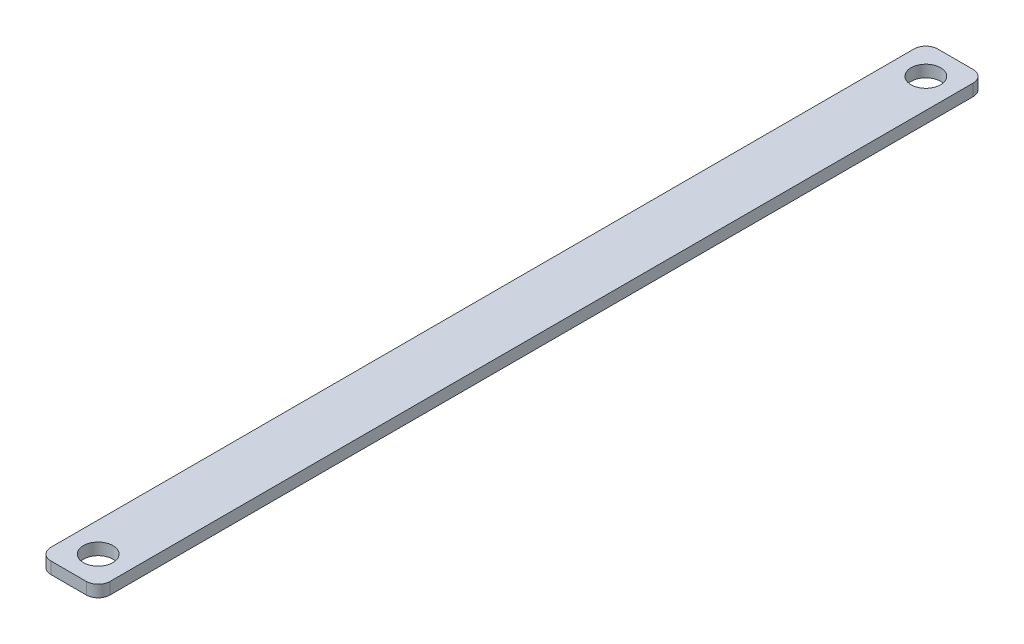
ISO-10303-21;
HEADER;
FILE_DESCRIPTION(('STEP AP214'),'2;1');
FILE_NAME('part.step','',(''),(''),'','','');
FILE_SCHEMA(('AUTOMOTIVE_DESIGN { 1 0 10303 214 1 1 1 1 }'));
ENDSEC;
DATA;
#1=APPLICATION_CONTEXT('core data for automotive mechanical design processes');
#2=APPLICATION_PROTOCOL_DEFINITION('international standard','automotive_design',2000,#1);
#3=PRODUCT_CONTEXT('',#1,'mechanical');
#4=PRODUCT('Part','Part','',(#3));
#5=PRODUCT_RELATED_PRODUCT_CATEGORY('part','',(#4));
#6=PRODUCT_DEFINITION_FORMATION('','',#4);
#7=PRODUCT_DEFINITION_CONTEXT('part definition',#1,'design');
#8=PRODUCT_DEFINITION('design','',#6,#7);
#9=PRODUCT_DEFINITION_SHAPE('','',#8);
#10=(LENGTH_UNIT() NAMED_UNIT(*) SI_UNIT(.MILLI.,.METRE.));
#11=(NAMED_UNIT(*) PLANE_ANGLE_UNIT() SI_UNIT($,.RADIAN.));
#12=(NAMED_UNIT(*) SI_UNIT($,.STERADIAN.) SOLID_ANGLE_UNIT());
#13=UNCERTAINTY_MEASURE_WITH_UNIT(LENGTH_MEASURE(1.E-05),#10,'distance_accuracy_value','');
#14=(GEOMETRIC_REPRESENTATION_CONTEXT(3) GLOBAL_UNCERTAINTY_ASSIGNED_CONTEXT((#13)) GLOBAL_UNIT_ASSIGNED_CONTEXT((#10,
#11,#12)) REPRESENTATION_CONTEXT('',''));
#15=CARTESIAN_POINT('',(0.,0.,0.));
#16=DIRECTION('',(0.,0.,1.));
#17=DIRECTION('',(1.,0.,0.));
#18=AXIS2_PLACEMENT_3D('',#15,#16,#17);
#19=CARTESIAN_POINT('',(40.,10.,-10.));
#20=DIRECTION('',(0.,1.,0.));
#21=DIRECTION('',(0.,0.,1.));
#22=AXIS2_PLACEMENT_3D('',#19,#20,#21);
#23=PLANE('',#22);
#24=CARTESIAN_POINT('',(25.,10.,-25.));
#25=DIRECTION('',(0.,1.,0.));
#26=DIRECTION('',(0.,0.,1.));
#27=AXIS2_PLACEMENT_3D('',#24,#25,#26);
#28=CIRCLE('',#27,12.5);
#29=CARTESIAN_POINT('',(25.,10.,-12.5));
#30=VERTEX_POINT('',#29);
#31=EDGE_CURVE('E134',#30,#30,#28,.T.);
#32=ORIENTED_EDGE('',*,*,#31,.F.);
#33=EDGE_LOOP('',(#32));
#34=FACE_BOUND('',#33,.T.);
#35=CARTESIAN_POINT('',(40.,10.,-10.));
#36=DIRECTION('',(0.,1.,0.));
#37=DIRECTION('',(0.,0.,1.));
#38=AXIS2_PLACEMENT_3D('',#35,#36,#37);
#39=CIRCLE('',#38,10.);
#40=CARTESIAN_POINT('',(39.9999999999999,10.,0.));
#41=VERTEX_POINT('',#40);
#42=CARTESIAN_POINT('',(50.,10.,-10.0000000000001));
#43=VERTEX_POINT('',#42);
#44=EDGE_CURVE('E145',#41,#43,#39,.T.);
#45=ORIENTED_EDGE('',*,*,#44,.T.);
#46=DIRECTION('',(0.,0.,-1.));
#47=VECTOR('',#46,1.);
#48=CARTESIAN_POINT('',(50.,10.,-10.0000000000001));
#49=LINE('',#48,#47);
#50=CARTESIAN_POINT('',(49.9999999999999,10.,-740.));
#51=VERTEX_POINT('',#50);
#52=EDGE_CURVE('E93',#43,#51,#49,.T.);
#53=ORIENTED_EDGE('',*,*,#52,.T.);
#54=CARTESIAN_POINT('',(39.9999999999999,10.,-740.));
#55=DIRECTION('',(0.,1.,0.));
#56=DIRECTION('',(0.,0.,-1.));
#57=AXIS2_PLACEMENT_3D('',#54,#55,#56);
#58=CIRCLE('',#57,10.);
#59=CARTESIAN_POINT('',(39.9999999999999,10.,-750.));
#60=VERTEX_POINT('',#59);
#61=EDGE_CURVE('E160',#51,#60,#58,.T.);
#62=ORIENTED_EDGE('',*,*,#61,.T.);
#63=DIRECTION('',(-1.,0.,0.));
#64=VECTOR('',#63,1.);
#65=CARTESIAN_POINT('',(10.,10.,-750.));
#66=LINE('',#65,#64);
#67=CARTESIAN_POINT('',(10.,10.,-750.));
#68=VERTEX_POINT('',#67);
#69=EDGE_CURVE('E173',#60,#68,#66,.T.);
#70=ORIENTED_EDGE('',*,*,#69,.T.);
#71=CARTESIAN_POINT('',(10.,10.,-740.));
#72=DIRECTION('',(0.,1.,0.));
#73=DIRECTION('',(0.,0.,-1.));
#74=AXIS2_PLACEMENT_3D('',#71,#72,#73);
#75=CIRCLE('',#74,10.);
#76=CARTESIAN_POINT('',(0.,10.,-740.));
#77=VERTEX_POINT('',#76);
#78=EDGE_CURVE('E112',#68,#77,#75,.T.);
#79=ORIENTED_EDGE('',*,*,#78,.T.);
#80=DIRECTION('',(0.,0.,1.));
#81=VECTOR('',#80,1.);
#82=CARTESIAN_POINT('',(0.,10.,-10.0000000000001));
#83=LINE('',#82,#81);
#84=CARTESIAN_POINT('',(0.,10.,-10.0000000000001));
#85=VERTEX_POINT('',#84);
#86=EDGE_CURVE('E106',#77,#85,#83,.T.);
#87=ORIENTED_EDGE('',*,*,#86,.T.);
#88=CARTESIAN_POINT('',(10.,10.,-10.));
#89=DIRECTION('',(0.,1.,0.));
#90=DIRECTION('',(0.,0.,-1.));
#91=AXIS2_PLACEMENT_3D('',#88,#89,#90);
#92=CIRCLE('',#91,10.);
#93=CARTESIAN_POINT('',(10.0000000000001,10.,0.));
#94=VERTEX_POINT('',#93);
#95=EDGE_CURVE('E110',#85,#94,#92,.T.);
#96=ORIENTED_EDGE('',*,*,#95,.T.);
#97=DIRECTION('',(1.,0.,0.));
#98=VECTOR('',#97,1.);
#99=CARTESIAN_POINT('',(10.0000000000001,10.,0.));
#100=LINE('',#99,#98);
#101=EDGE_CURVE('E50',#94,#41,#100,.T.);
#102=ORIENTED_EDGE('',*,*,#101,.T.);
#103=EDGE_LOOP('',(#45,#53,#62,#70,#79,#87,#96,#102));
#104=FACE_BOUND('',#103,.T.);
#105=CARTESIAN_POINT('',(25.,10.,-725.));
#106=DIRECTION('',(0.,1.,0.));
#107=DIRECTION('',(0.,0.,1.));
#108=AXIS2_PLACEMENT_3D('',#105,#106,#107);
#109=CIRCLE('',#108,12.5);
#110=CARTESIAN_POINT('',(25.,10.,-712.5));
#111=VERTEX_POINT('',#110);
#112=EDGE_CURVE('E182',#111,#111,#109,.T.);
#113=ORIENTED_EDGE('',*,*,#112,.F.);
#114=EDGE_LOOP('',(#113));
#115=FACE_BOUND('',#114,.T.);
#116=ADVANCED_FACE('F33',(#34,#104,#115),#23,.T.);
#117=CARTESIAN_POINT('',(40.,0.,-10.));
#118=DIRECTION('',(0.,1.,0.));
#119=DIRECTION('',(0.,0.,1.));
#120=AXIS2_PLACEMENT_3D('',#117,#118,#119);
#121=PLANE('',#120);
#122=CARTESIAN_POINT('',(25.,0.,-25.));
#123=DIRECTION('',(0.,1.,0.));
#124=DIRECTION('',(0.,0.,1.));
#125=AXIS2_PLACEMENT_3D('',#122,#123,#124);
#126=CIRCLE('',#125,12.5);
#127=CARTESIAN_POINT('',(25.,0.,-12.5));
#128=VERTEX_POINT('',#127);
#129=EDGE_CURVE('E179',#128,#128,#126,.T.);
#130=ORIENTED_EDGE('',*,*,#129,.T.);
#131=EDGE_LOOP('',(#130));
#132=FACE_BOUND('',#131,.T.);
#133=CARTESIAN_POINT('',(40.,0.,-10.));
#134=DIRECTION('',(0.,1.,0.));
#135=DIRECTION('',(0.,0.,1.));
#136=AXIS2_PLACEMENT_3D('',#133,#134,#135);
#137=CIRCLE('',#136,10.);
#138=CARTESIAN_POINT('',(39.9999999999999,0.,0.));
#139=VERTEX_POINT('',#138);
#140=CARTESIAN_POINT('',(50.,0.,-10.0000000000001));
#141=VERTEX_POINT('',#140);
#142=EDGE_CURVE('E130',#139,#141,#137,.T.);
#143=ORIENTED_EDGE('',*,*,#142,.F.);
#144=DIRECTION('',(1.,0.,0.));
#145=VECTOR('',#144,1.);
#146=CARTESIAN_POINT('',(10.0000000000001,0.,0.));
#147=LINE('',#146,#145);
#148=CARTESIAN_POINT('',(10.0000000000001,0.,0.));
#149=VERTEX_POINT('',#148);
#150=EDGE_CURVE('E85',#149,#139,#147,.T.);
#151=ORIENTED_EDGE('',*,*,#150,.F.);
#152=CARTESIAN_POINT('',(10.,0.,-10.));
#153=DIRECTION('',(0.,1.,0.));
#154=DIRECTION('',(0.,0.,-1.));
#155=AXIS2_PLACEMENT_3D('',#152,#153,#154);
#156=CIRCLE('',#155,10.);
#157=CARTESIAN_POINT('',(0.,0.,-10.0000000000001));
#158=VERTEX_POINT('',#157);
#159=EDGE_CURVE('E79',#158,#149,#156,.T.);
#160=ORIENTED_EDGE('',*,*,#159,.F.);
#161=DIRECTION('',(0.,0.,1.));
#162=VECTOR('',#161,1.);
#163=CARTESIAN_POINT('',(0.,0.,-10.0000000000001));
#164=LINE('',#163,#162);
#165=CARTESIAN_POINT('',(0.,0.,-740.));
#166=VERTEX_POINT('',#165);
#167=EDGE_CURVE('E120',#166,#158,#164,.T.);
#168=ORIENTED_EDGE('',*,*,#167,.F.);
#169=CARTESIAN_POINT('',(10.,0.,-740.));
#170=DIRECTION('',(0.,1.,0.));
#171=DIRECTION('',(0.,0.,-1.));
#172=AXIS2_PLACEMENT_3D('',#169,#170,#171);
#173=CIRCLE('',#172,10.);
#174=CARTESIAN_POINT('',(10.,0.,-750.));
#175=VERTEX_POINT('',#174);
#176=EDGE_CURVE('E140',#175,#166,#173,.T.);
#177=ORIENTED_EDGE('',*,*,#176,.F.);
#178=DIRECTION('',(-1.,0.,0.));
#179=VECTOR('',#178,1.);
#180=CARTESIAN_POINT('',(10.,0.,-750.));
#181=LINE('',#180,#179);
#182=CARTESIAN_POINT('',(39.9999999999999,0.,-750.));
#183=VERTEX_POINT('',#182);
#184=EDGE_CURVE('E138',#183,#175,#181,.T.);
#185=ORIENTED_EDGE('',*,*,#184,.F.);
#186=CARTESIAN_POINT('',(39.9999999999999,0.,-740.));
#187=DIRECTION('',(0.,1.,0.));
#188=DIRECTION('',(0.,0.,-1.));
#189=AXIS2_PLACEMENT_3D('',#186,#187,#188);
#190=CIRCLE('',#189,10.);
#191=CARTESIAN_POINT('',(49.9999999999999,0.,-740.));
#192=VERTEX_POINT('',#191);
#193=EDGE_CURVE('E136',#192,#183,#190,.T.);
#194=ORIENTED_EDGE('',*,*,#193,.F.);
#195=DIRECTION('',(0.,0.,-1.));
#196=VECTOR('',#195,1.);
#197=CARTESIAN_POINT('',(50.,0.,-10.0000000000001));
#198=LINE('',#197,#196);
#199=EDGE_CURVE('E133',#141,#192,#198,.T.);
#200=ORIENTED_EDGE('',*,*,#199,.F.);
#201=EDGE_LOOP('',(#143,#151,#160,#168,#177,#185,#194,#200));
#202=FACE_BOUND('',#201,.T.);
#203=CARTESIAN_POINT('',(25.,0.,-725.));
#204=DIRECTION('',(0.,1.,0.));
#205=DIRECTION('',(0.,0.,1.));
#206=AXIS2_PLACEMENT_3D('',#203,#204,#205);
#207=CIRCLE('',#206,12.5);
#208=CARTESIAN_POINT('',(25.,0.,-712.5));
#209=VERTEX_POINT('',#208);
#210=EDGE_CURVE('E185',#209,#209,#207,.T.);
#211=ORIENTED_EDGE('',*,*,#210,.T.);
#212=EDGE_LOOP('',(#211));
#213=FACE_BOUND('',#212,.T.);
#214=ADVANCED_FACE('F164',(#132,#202,#213),#121,.F.);
#215=CARTESIAN_POINT('',(40.,10.,-10.));
#216=DIRECTION('',(0.,-1.,0.));
#217=DIRECTION('',(0.,0.,-1.));
#218=AXIS2_PLACEMENT_3D('',#215,#216,#217);
#219=CYLINDRICAL_SURFACE('',#218,10.);
#220=ORIENTED_EDGE('',*,*,#142,.T.);
#221=DIRECTION('',(0.,-1.,0.));
#222=VECTOR('',#221,1.);
#223=CARTESIAN_POINT('',(50.,10.,-10.0000000000001));
#224=LINE('',#223,#222);
#225=EDGE_CURVE('E11',#43,#141,#224,.T.);
#226=ORIENTED_EDGE('',*,*,#225,.F.);
#227=ORIENTED_EDGE('',*,*,#44,.F.);
#228=DIRECTION('',(0.,-1.,0.));
#229=VECTOR('',#228,1.);
#230=CARTESIAN_POINT('',(39.9999999999999,10.,0.));
#231=LINE('',#230,#229);
#232=EDGE_CURVE('E126',#41,#139,#231,.T.);
#233=ORIENTED_EDGE('',*,*,#232,.T.);
#234=EDGE_LOOP('',(#220,#226,#227,#233));
#235=FACE_BOUND('',#234,.T.);
#236=ADVANCED_FACE('F35',(#235),#219,.T.);
#237=CARTESIAN_POINT('',(50.,10.,-10.0000000000001));
#238=DIRECTION('',(-1.,0.,0.));
#239=DIRECTION('',(0.,0.,1.));
#240=AXIS2_PLACEMENT_3D('',#237,#238,#239);
#241=PLANE('',#240);
#242=ORIENTED_EDGE('',*,*,#199,.T.);
#243=DIRECTION('',(0.,-1.,0.));
#244=VECTOR('',#243,1.);
#245=CARTESIAN_POINT('',(49.9999999999999,10.,-740.));
#246=LINE('',#245,#244);
#247=EDGE_CURVE('E42',#51,#192,#246,.T.);
#248=ORIENTED_EDGE('',*,*,#247,.F.);
#249=ORIENTED_EDGE('',*,*,#52,.F.);
#250=ORIENTED_EDGE('',*,*,#225,.T.);
#251=EDGE_LOOP('',(#242,#248,#249,#250));
#252=FACE_BOUND('',#251,.T.);
#253=ADVANCED_FACE('F218',(#252),#241,.F.);
#254=CARTESIAN_POINT('',(39.9999999999999,10.,-740.));
#255=DIRECTION('',(0.,-1.,0.));
#256=DIRECTION('',(0.,0.,-1.));
#257=AXIS2_PLACEMENT_3D('',#254,#255,#256);
#258=CYLINDRICAL_SURFACE('',#257,10.);
#259=ORIENTED_EDGE('',*,*,#193,.T.);
#260=DIRECTION('',(0.,-1.,0.));
#261=VECTOR('',#260,1.);
#262=CARTESIAN_POINT('',(39.9999999999999,10.,-750.));
#263=LINE('',#262,#261);
#264=EDGE_CURVE('E152',#60,#183,#263,.T.);
#265=ORIENTED_EDGE('',*,*,#264,.F.);
#266=ORIENTED_EDGE('',*,*,#61,.F.);
#267=ORIENTED_EDGE('',*,*,#247,.T.);
#268=EDGE_LOOP('',(#259,#265,#266,#267));
#269=FACE_BOUND('',#268,.T.);
#270=ADVANCED_FACE('F158',(#269),#258,.T.);
#271=CARTESIAN_POINT('',(10.,10.,-750.));
#272=DIRECTION('',(0.,0.,1.));
#273=DIRECTION('',(1.,0.,0.));
#274=AXIS2_PLACEMENT_3D('',#271,#272,#273);
#275=PLANE('',#274);
#276=ORIENTED_EDGE('',*,*,#184,.T.);
#277=DIRECTION('',(0.,-1.,0.));
#278=VECTOR('',#277,1.);
#279=CARTESIAN_POINT('',(10.,10.,-750.));
#280=LINE('',#279,#278);
#281=EDGE_CURVE('E149',#68,#175,#280,.T.);
#282=ORIENTED_EDGE('',*,*,#281,.F.);
#283=ORIENTED_EDGE('',*,*,#69,.F.);
#284=ORIENTED_EDGE('',*,*,#264,.T.);
#285=EDGE_LOOP('',(#276,#282,#283,#284));
#286=FACE_BOUND('',#285,.T.);
#287=ADVANCED_FACE('F169',(#286),#275,.F.);
#288=CARTESIAN_POINT('',(10.,10.,-740.));
#289=DIRECTION('',(0.,-1.,0.));
#290=DIRECTION('',(0.,0.,-1.));
#291=AXIS2_PLACEMENT_3D('',#288,#289,#290);
#292=CYLINDRICAL_SURFACE('',#291,10.);
#293=ORIENTED_EDGE('',*,*,#176,.T.);
#294=DIRECTION('',(0.,-1.,0.));
#295=VECTOR('',#294,1.);
#296=CARTESIAN_POINT('',(0.,10.,-740.));
#297=LINE('',#296,#295);
#298=EDGE_CURVE('E121',#77,#166,#297,.T.);
#299=ORIENTED_EDGE('',*,*,#298,.F.);
#300=ORIENTED_EDGE('',*,*,#78,.F.);
#301=ORIENTED_EDGE('',*,*,#281,.T.);
#302=EDGE_LOOP('',(#293,#299,#300,#301));
#303=FACE_BOUND('',#302,.T.);
#304=ADVANCED_FACE('F172',(#303),#292,.T.);
#305=CARTESIAN_POINT('',(0.,10.,-10.0000000000001));
#306=DIRECTION('',(1.,0.,0.));
#307=DIRECTION('',(0.,0.,-1.));
#308=AXIS2_PLACEMENT_3D('',#305,#306,#307);
#309=PLANE('',#308);
#310=ORIENTED_EDGE('',*,*,#167,.T.);
#311=DIRECTION('',(0.,-1.,0.));
#312=VECTOR('',#311,1.);
#313=CARTESIAN_POINT('',(0.,10.,-10.0000000000001));
#314=LINE('',#313,#312);
#315=EDGE_CURVE('E117',#85,#158,#314,.T.);
#316=ORIENTED_EDGE('',*,*,#315,.F.);
#317=ORIENTED_EDGE('',*,*,#86,.F.);
#318=ORIENTED_EDGE('',*,*,#298,.T.);
#319=EDGE_LOOP('',(#310,#316,#317,#318));
#320=FACE_BOUND('',#319,.T.);
#321=ADVANCED_FACE('F118',(#320),#309,.F.);
#322=CARTESIAN_POINT('',(10.,10.,-10.));
#323=DIRECTION('',(0.,-1.,0.));
#324=DIRECTION('',(0.,0.,-1.));
#325=AXIS2_PLACEMENT_3D('',#322,#323,#324);
#326=CYLINDRICAL_SURFACE('',#325,10.);
#327=ORIENTED_EDGE('',*,*,#159,.T.);
#328=DIRECTION('',(0.,-1.,0.));
#329=VECTOR('',#328,1.);
#330=CARTESIAN_POINT('',(10.0000000000001,10.,0.));
#331=LINE('',#330,#329);
#332=EDGE_CURVE('E122',#94,#149,#331,.T.);
#333=ORIENTED_EDGE('',*,*,#332,.F.);
#334=ORIENTED_EDGE('',*,*,#95,.F.);
#335=ORIENTED_EDGE('',*,*,#315,.T.);
#336=EDGE_LOOP('',(#327,#333,#334,#335));
#337=FACE_BOUND('',#336,.T.);
#338=ADVANCED_FACE('F124',(#337),#326,.T.);
#339=CARTESIAN_POINT('',(10.0000000000001,10.,0.));
#340=DIRECTION('',(0.,0.,-1.));
#341=DIRECTION('',(-1.,0.,0.));
#342=AXIS2_PLACEMENT_3D('',#339,#340,#341);
#343=PLANE('',#342);
#344=ORIENTED_EDGE('',*,*,#150,.T.);
#345=ORIENTED_EDGE('',*,*,#232,.F.);
#346=ORIENTED_EDGE('',*,*,#101,.F.);
#347=ORIENTED_EDGE('',*,*,#332,.T.);
#348=EDGE_LOOP('',(#344,#345,#346,#347));
#349=FACE_BOUND('',#348,.T.);
#350=ADVANCED_FACE('F206',(#349),#343,.F.);
#351=CARTESIAN_POINT('',(25.,10.,-25.));
#352=DIRECTION('',(0.,-1.,0.));
#353=DIRECTION('',(0.,0.,-1.));
#354=AXIS2_PLACEMENT_3D('',#351,#352,#353);
#355=CYLINDRICAL_SURFACE('',#354,12.5);
#356=ORIENTED_EDGE('',*,*,#31,.T.);
#357=EDGE_LOOP('',(#356));
#358=FACE_BOUND('',#357,.T.);
#359=ORIENTED_EDGE('',*,*,#129,.F.);
#360=EDGE_LOOP('',(#359));
#361=FACE_BOUND('',#360,.T.);
#362=ADVANCED_FACE('F203',(#358,#361),#355,.F.);
#363=CARTESIAN_POINT('',(25.,10.,-725.));
#364=DIRECTION('',(0.,-1.,0.));
#365=DIRECTION('',(0.,0.,-1.));
#366=AXIS2_PLACEMENT_3D('',#363,#364,#365);
#367=CYLINDRICAL_SURFACE('',#366,12.5);
#368=ORIENTED_EDGE('',*,*,#112,.T.);
#369=EDGE_LOOP('',(#368));
#370=FACE_BOUND('',#369,.T.);
#371=ORIENTED_EDGE('',*,*,#210,.F.);
#372=EDGE_LOOP('',(#371));
#373=FACE_BOUND('',#372,.T.);
#374=ADVANCED_FACE('F191',(#370,#373),#367,.F.);
#375=CLOSED_SHELL('',(#116,#214,#236,#253,#270,#287,#304,#321,#338,#350,#362,#374));
#376=MANIFOLD_SOLID_BREP('B2',#375);
#377=ADVANCED_BREP_SHAPE_REPRESENTATION('',(#18,#376),#14);
#378=SHAPE_DEFINITION_REPRESENTATION(#9,#377);
ENDSEC;
END-ISO-10303-21;
